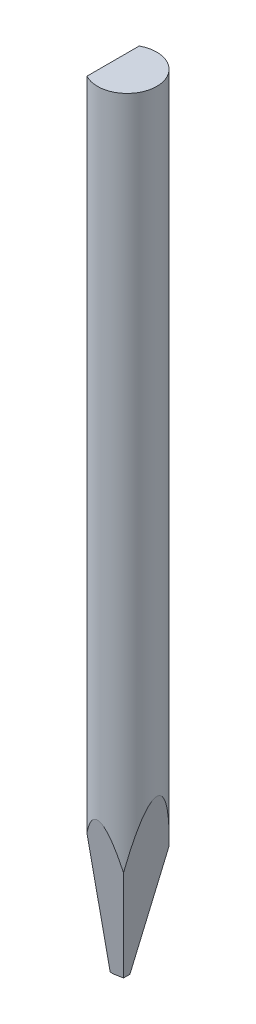
ISO-10303-21;
HEADER;
FILE_DESCRIPTION(('STEP AP214'),'2;1');
FILE_NAME('part.step','',(''),(''),'','','');
FILE_SCHEMA(('AUTOMOTIVE_DESIGN { 1 0 10303 214 1 1 1 1 }'));
ENDSEC;
DATA;
#1=APPLICATION_CONTEXT('core data for automotive mechanical design processes');
#2=APPLICATION_PROTOCOL_DEFINITION('international standard','automotive_design',2000,#1);
#3=PRODUCT_CONTEXT('',#1,'mechanical');
#4=PRODUCT('Part','Part','',(#3));
#5=PRODUCT_RELATED_PRODUCT_CATEGORY('part','',(#4));
#6=PRODUCT_DEFINITION_FORMATION('','',#4);
#7=PRODUCT_DEFINITION_CONTEXT('part definition',#1,'design');
#8=PRODUCT_DEFINITION('design','',#6,#7);
#9=PRODUCT_DEFINITION_SHAPE('','',#8);
#10=(LENGTH_UNIT() NAMED_UNIT(*) SI_UNIT(.MILLI.,.METRE.));
#11=(NAMED_UNIT(*) PLANE_ANGLE_UNIT() SI_UNIT($,.RADIAN.));
#12=(NAMED_UNIT(*) SI_UNIT($,.STERADIAN.) SOLID_ANGLE_UNIT());
#13=UNCERTAINTY_MEASURE_WITH_UNIT(LENGTH_MEASURE(1.E-05),#10,'distance_accuracy_value','');
#14=(GEOMETRIC_REPRESENTATION_CONTEXT(3) GLOBAL_UNCERTAINTY_ASSIGNED_CONTEXT((#13)) GLOBAL_UNIT_ASSIGNED_CONTEXT((#10,
#11,#12)) REPRESENTATION_CONTEXT('',''));
#15=CARTESIAN_POINT('',(0.,0.,0.));
#16=DIRECTION('',(0.,0.,1.));
#17=DIRECTION('',(1.,0.,0.));
#18=AXIS2_PLACEMENT_3D('',#15,#16,#17);
#19=CARTESIAN_POINT('',(0.,0.,0.));
#20=DIRECTION('',(0.,1.,0.));
#21=DIRECTION('',(0.,0.,1.));
#22=AXIS2_PLACEMENT_3D('',#19,#20,#21);
#23=PLANE('',#22);
#24=DIRECTION('',(0.,0.,-1.));
#25=VECTOR('',#24,1.);
#26=CARTESIAN_POINT('',(-0.29972,0.,27.2760283406468));
#27=LINE('',#26,#25);
#28=CARTESIAN_POINT('',(-0.299719999999993,0.,0.0762000000000001));
#29=VERTEX_POINT('',#28);
#30=CARTESIAN_POINT('',(-0.299719999999993,0.,-0.0762000000000001));
#31=VERTEX_POINT('',#30);
#32=EDGE_CURVE('E106',#29,#31,#27,.T.);
#33=ORIENTED_EDGE('',*,*,#32,.F.);
#34=DIRECTION('',(-1.,0.,0.));
#35=VECTOR('',#34,1.);
#36=CARTESIAN_POINT('',(26.8738719491216,0.,0.0762));
#37=LINE('',#36,#35);
#38=CARTESIAN_POINT('',(-0.375919999999998,0.,0.0762));
#39=VERTEX_POINT('',#38);
#40=EDGE_CURVE('E131',#29,#39,#37,.T.);
#41=ORIENTED_EDGE('',*,*,#40,.T.);
#42=DIRECTION('',(0.,0.,1.));
#43=VECTOR('',#42,1.);
#44=CARTESIAN_POINT('',(-0.37592,0.,0.));
#45=LINE('',#44,#43);
#46=CARTESIAN_POINT('',(-0.37592,0.,-0.0762000000000005));
#47=VERTEX_POINT('',#46);
#48=EDGE_CURVE('E117',#47,#39,#45,.T.);
#49=ORIENTED_EDGE('',*,*,#48,.F.);
#50=DIRECTION('',(-1.,0.,0.));
#51=VECTOR('',#50,1.);
#52=CARTESIAN_POINT('',(26.8738719491216,0.,-0.0762));
#53=LINE('',#52,#51);
#54=EDGE_CURVE('E129',#31,#47,#53,.T.);
#55=ORIENTED_EDGE('',*,*,#54,.F.);
#56=EDGE_LOOP('',(#33,#41,#49,#55));
#57=FACE_BOUND('',#56,.T.);
#58=ADVANCED_FACE('F39',(#57),#23,.F.);
#59=CARTESIAN_POINT('',(0.,21.0312,0.));
#60=DIRECTION('',(0.,-1.,0.));
#61=DIRECTION('',(0.,0.,-1.));
#62=AXIS2_PLACEMENT_3D('',#59,#60,#61);
#63=CYLINDRICAL_SURFACE('',#62,0.792479999999998);
#64=CARTESIAN_POINT('',(0.,-0.432151674654869,0.));
#65=DIRECTION('',(0.,-0.173648177666931,0.984807753012208));
#66=DIRECTION('',(0.,-0.984807753012208,-0.173648177666931));
#67=AXIS2_PLACEMENT_3D('',#64,#65,#66);
#68=ELLIPSE('',#67,4.56371043248163,0.792479999999998);
#69=CARTESIAN_POINT('',(0.510025990868476,3.00774157611953,0.606545990868479));
#70=VERTEX_POINT('',#69);
#71=CARTESIAN_POINT('',(-0.37592,3.52439037249585,0.69764511322018));
#72=VERTEX_POINT('',#71);
#73=EDGE_CURVE('E100',#70,#72,#68,.T.);
#74=ORIENTED_EDGE('',*,*,#73,.F.);
#75=CARTESIAN_POINT('',(0.,0.115240446574631,0.));
#76=DIRECTION('',(-0.984807753012208,0.173648177666931,0.));
#77=DIRECTION('',(-0.173648177666931,-0.984807753012208,0.));
#78=AXIS2_PLACEMENT_3D('',#75,#76,#77);
#79=ELLIPSE('',#78,4.56371043248165,0.792479999999998);
#80=CARTESIAN_POINT('',(0.510025990868476,3.00774157611953,-0.606545990868479));
#81=VERTEX_POINT('',#80);
#82=EDGE_CURVE('E103',#70,#81,#79,.T.);
#83=ORIENTED_EDGE('',*,*,#82,.T.);
#84=CARTESIAN_POINT('',(0.,-0.432151674654869,0.));
#85=DIRECTION('',(0.,-0.173648177666931,-0.984807753012208));
#86=DIRECTION('',(0.,-0.984807753012208,0.173648177666931));
#87=AXIS2_PLACEMENT_3D('',#84,#85,#86);
#88=ELLIPSE('',#87,4.56371043248163,0.792479999999998);
#89=CARTESIAN_POINT('',(-0.37592,3.52439037249585,-0.69764511322018));
#90=VERTEX_POINT('',#89);
#91=EDGE_CURVE('E90',#90,#81,#88,.T.);
#92=ORIENTED_EDGE('',*,*,#91,.F.);
#93=DIRECTION('',(0.,-1.,0.));
#94=VECTOR('',#93,1.);
#95=CARTESIAN_POINT('',(-0.37592,21.0312,-0.69764511322018));
#96=LINE('',#95,#94);
#97=CARTESIAN_POINT('',(-0.37592,21.0312,-0.69764511322018));
#98=VERTEX_POINT('',#97);
#99=EDGE_CURVE('E123',#98,#90,#96,.T.);
#100=ORIENTED_EDGE('',*,*,#99,.F.);
#101=CARTESIAN_POINT('',(0.,21.0312,0.));
#102=DIRECTION('',(0.,1.,0.));
#103=DIRECTION('',(0.,0.,1.));
#104=AXIS2_PLACEMENT_3D('',#101,#102,#103);
#105=CIRCLE('',#104,0.792479999999998);
#106=CARTESIAN_POINT('',(-0.37592,21.0312,0.69764511322018));
#107=VERTEX_POINT('',#106);
#108=EDGE_CURVE('E120',#107,#98,#105,.T.);
#109=ORIENTED_EDGE('',*,*,#108,.F.);
#110=DIRECTION('',(0.,-1.,0.));
#111=VECTOR('',#110,1.);
#112=CARTESIAN_POINT('',(-0.37592,21.0312,0.69764511322018));
#113=LINE('',#112,#111);
#114=EDGE_CURVE('E125',#72,#107,#113,.F.);
#115=ORIENTED_EDGE('',*,*,#114,.F.);
#116=EDGE_LOOP('',(#74,#83,#92,#100,#109,#115));
#117=FACE_BOUND('',#116,.T.);
#118=ADVANCED_FACE('F41',(#117),#63,.T.);
#119=CARTESIAN_POINT('',(-0.37592,21.0312,-0.80247998));
#120=DIRECTION('',(-1.,0.,0.));
#121=DIRECTION('',(0.,0.,1.));
#122=AXIS2_PLACEMENT_3D('',#119,#120,#121);
#123=PLANE('',#122);
#124=ORIENTED_EDGE('',*,*,#99,.T.);
#125=DIRECTION('',(0.,-0.984807753012208,0.173648177666931));
#126=VECTOR('',#125,1.);
#127=CARTESIAN_POINT('',(-0.37592,20.5212329145634,-3.69464704024015));
#128=LINE('',#127,#126);
#129=EDGE_CURVE('E95',#90,#47,#128,.T.);
#130=ORIENTED_EDGE('',*,*,#129,.T.);
#131=ORIENTED_EDGE('',*,*,#48,.T.);
#132=DIRECTION('',(0.,0.984807753012208,0.173648177666931));
#133=VECTOR('',#132,1.);
#134=CARTESIAN_POINT('',(-0.37592,20.2467685967878,3.64625157577457));
#135=LINE('',#134,#133);
#136=EDGE_CURVE('E112',#39,#72,#135,.T.);
#137=ORIENTED_EDGE('',*,*,#136,.T.);
#138=ORIENTED_EDGE('',*,*,#114,.T.);
#139=DIRECTION('',(0.,0.,-1.));
#140=VECTOR('',#139,1.);
#141=CARTESIAN_POINT('',(-0.37592,21.0312,-0.80247998));
#142=LINE('',#141,#140);
#143=EDGE_CURVE('E99',#107,#98,#142,.T.);
#144=ORIENTED_EDGE('',*,*,#143,.T.);
#145=EDGE_LOOP('',(#124,#130,#131,#137,#138,#144));
#146=FACE_BOUND('',#145,.T.);
#147=ADVANCED_FACE('F145',(#146),#123,.T.);
#148=CARTESIAN_POINT('',(0.,21.0312,0.));
#149=DIRECTION('',(0.,1.,0.));
#150=DIRECTION('',(0.,0.,1.));
#151=AXIS2_PLACEMENT_3D('',#148,#149,#150);
#152=PLANE('',#151);
#153=ORIENTED_EDGE('',*,*,#108,.T.);
#154=ORIENTED_EDGE('',*,*,#143,.F.);
#155=EDGE_LOOP('',(#153,#154));
#156=FACE_BOUND('',#155,.T.);
#157=ADVANCED_FACE('F149',(#156),#152,.T.);
#158=CARTESIAN_POINT('',(26.8738719491216,0.,0.0762));
#159=DIRECTION('',(0.,-0.173648177666931,0.984807753012208));
#160=DIRECTION('',(0.,-0.984807753012208,-0.173648177666931));
#161=AXIS2_PLACEMENT_3D('',#158,#159,#160);
#162=PLANE('',#161);
#163=DIRECTION('',(-0.984346441568213,-0.173566836012845,-0.0306045161452665));
#164=VECTOR('',#163,1.);
#165=CARTESIAN_POINT('',(26.0298035813508,4.64260539659194,0.894816592201888));
#166=LINE('',#165,#164);
#167=CARTESIAN_POINT('',(-0.0113543651851166,0.0508466417269886,0.0851656348148851));
#168=VERTEX_POINT('',#167);
#169=EDGE_CURVE('E54',#168,#29,#166,.T.);
#170=ORIENTED_EDGE('',*,*,#169,.F.);
#171=DIRECTION('',(-0.171087869746036,-0.970287525247814,-0.171087869746036));
#172=VECTOR('',#171,1.);
#173=CARTESIAN_POINT('',(0.766901483986011,4.46455489014234,0.863421483986016));
#174=LINE('',#173,#172);
#175=EDGE_CURVE('E58',#70,#168,#174,.T.);
#176=ORIENTED_EDGE('',*,*,#175,.F.);
#177=ORIENTED_EDGE('',*,*,#73,.T.);
#178=ORIENTED_EDGE('',*,*,#136,.F.);
#179=ORIENTED_EDGE('',*,*,#40,.F.);
#180=EDGE_LOOP('',(#170,#176,#177,#178,#179));
#181=FACE_BOUND('',#180,.T.);
#182=ADVANCED_FACE('F143',(#181),#162,.T.);
#183=CARTESIAN_POINT('',(26.8738719491216,0.,-0.0762));
#184=DIRECTION('',(0.,-0.173648177666931,-0.984807753012208));
#185=DIRECTION('',(0.,0.984807753012208,-0.173648177666931));
#186=AXIS2_PLACEMENT_3D('',#183,#184,#185);
#187=PLANE('',#186);
#188=DIRECTION('',(0.984346441568213,0.173566836012845,-0.0306045161452665));
#189=VECTOR('',#188,1.);
#190=CARTESIAN_POINT('',(26.0298035813508,4.64260539659194,-0.894816592201888));
#191=LINE('',#190,#189);
#192=CARTESIAN_POINT('',(-0.0113543651851166,0.0508466417269886,-0.0851656348148851));
#193=VERTEX_POINT('',#192);
#194=EDGE_CURVE('E11',#31,#193,#191,.T.);
#195=ORIENTED_EDGE('',*,*,#194,.F.);
#196=ORIENTED_EDGE('',*,*,#54,.T.);
#197=ORIENTED_EDGE('',*,*,#129,.F.);
#198=ORIENTED_EDGE('',*,*,#91,.T.);
#199=DIRECTION('',(0.171087869746036,0.970287525247814,-0.171087869746036));
#200=VECTOR('',#199,1.);
#201=CARTESIAN_POINT('',(0.766901483986011,4.46455489014234,-0.863421483986016));
#202=LINE('',#201,#200);
#203=EDGE_CURVE('E47',#193,#81,#202,.T.);
#204=ORIENTED_EDGE('',*,*,#203,.F.);
#205=EDGE_LOOP('',(#195,#196,#197,#198,#204));
#206=FACE_BOUND('',#205,.T.);
#207=ADVANCED_FACE('F92',(#206),#187,.T.);
#208=CARTESIAN_POINT('',(-0.29972,0.,27.2760283406468));
#209=DIRECTION('',(-0.173648177666931,0.984807753012208,0.));
#210=DIRECTION('',(-0.984807753012208,-0.173648177666931,0.));
#211=AXIS2_PLACEMENT_3D('',#208,#209,#210);
#212=PLANE('',#211);
#213=DIRECTION('',(0.,0.,-1.));
#214=VECTOR('',#213,1.);
#215=CARTESIAN_POINT('',(-0.0113543651851151,0.0508466417269888,27.2760283406468));
#216=LINE('',#215,#214);
#217=EDGE_CURVE('E111',#168,#193,#216,.T.);
#218=ORIENTED_EDGE('',*,*,#217,.F.);
#219=ORIENTED_EDGE('',*,*,#169,.T.);
#220=ORIENTED_EDGE('',*,*,#32,.T.);
#221=ORIENTED_EDGE('',*,*,#194,.T.);
#222=EDGE_LOOP('',(#218,#219,#220,#221));
#223=FACE_BOUND('',#222,.T.);
#224=ADVANCED_FACE('F138',(#223),#212,.F.);
#225=CARTESIAN_POINT('',(-0.0113543651851151,0.0508466417269888,27.2760283406468));
#226=DIRECTION('',(-0.984807753012208,0.173648177666931,0.));
#227=DIRECTION('',(-0.173648177666931,-0.984807753012208,0.));
#228=AXIS2_PLACEMENT_3D('',#225,#226,#227);
#229=PLANE('',#228);
#230=ORIENTED_EDGE('',*,*,#82,.F.);
#231=ORIENTED_EDGE('',*,*,#175,.T.);
#232=ORIENTED_EDGE('',*,*,#217,.T.);
#233=ORIENTED_EDGE('',*,*,#203,.T.);
#234=EDGE_LOOP('',(#230,#231,#232,#233));
#235=FACE_BOUND('',#234,.T.);
#236=ADVANCED_FACE('F109',(#235),#229,.F.);
#237=CLOSED_SHELL('',(#58,#118,#147,#157,#182,#207,#224,#236));
#238=MANIFOLD_SOLID_BREP('B2',#237);
#239=ADVANCED_BREP_SHAPE_REPRESENTATION('',(#18,#238),#14);
#240=SHAPE_DEFINITION_REPRESENTATION(#9,#239);
ENDSEC;
END-ISO-10303-21;
